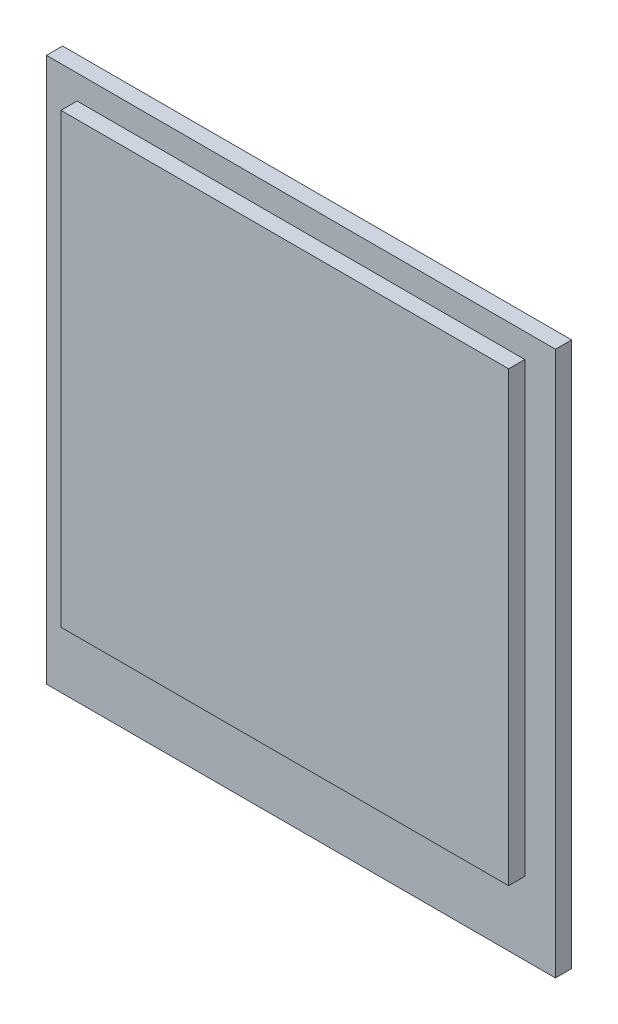
ISO-10303-21;
HEADER;
FILE_DESCRIPTION(('STEP AP214'),'2;1');
FILE_NAME('part.step','',(''),(''),'','','');
FILE_SCHEMA(('AUTOMOTIVE_DESIGN { 1 0 10303 214 1 1 1 1 }'));
ENDSEC;
DATA;
#1=APPLICATION_CONTEXT('core data for automotive mechanical design processes');
#2=APPLICATION_PROTOCOL_DEFINITION('international standard','automotive_design',2000,#1);
#3=PRODUCT_CONTEXT('',#1,'mechanical');
#4=PRODUCT('Part','Part','',(#3));
#5=PRODUCT_RELATED_PRODUCT_CATEGORY('part','',(#4));
#6=PRODUCT_DEFINITION_FORMATION('','',#4);
#7=PRODUCT_DEFINITION_CONTEXT('part definition',#1,'design');
#8=PRODUCT_DEFINITION('design','',#6,#7);
#9=PRODUCT_DEFINITION_SHAPE('','',#8);
#10=(LENGTH_UNIT() NAMED_UNIT(*) SI_UNIT(.MILLI.,.METRE.));
#11=(NAMED_UNIT(*) PLANE_ANGLE_UNIT() SI_UNIT($,.RADIAN.));
#12=(NAMED_UNIT(*) SI_UNIT($,.STERADIAN.) SOLID_ANGLE_UNIT());
#13=UNCERTAINTY_MEASURE_WITH_UNIT(LENGTH_MEASURE(1.E-05),#10,'distance_accuracy_value','');
#14=(GEOMETRIC_REPRESENTATION_CONTEXT(3) GLOBAL_UNCERTAINTY_ASSIGNED_CONTEXT((#13)) GLOBAL_UNIT_ASSIGNED_CONTEXT((#10,
#11,#12)) REPRESENTATION_CONTEXT('',''));
#15=CARTESIAN_POINT('',(0.,0.,0.));
#16=DIRECTION('',(0.,0.,1.));
#17=DIRECTION('',(1.,0.,0.));
#18=AXIS2_PLACEMENT_3D('',#15,#16,#17);
#19=CARTESIAN_POINT('',(13.86,-13.86,-1.));
#20=DIRECTION('',(1.,0.,0.));
#21=DIRECTION('',(0.,1.,0.));
#22=AXIS2_PLACEMENT_3D('',#19,#20,#21);
#23=PLANE('',#22);
#24=DIRECTION('',(0.,1.,0.));
#25=VECTOR('',#24,1.);
#26=CARTESIAN_POINT('',(13.86,-13.86,0.));
#27=LINE('',#26,#25);
#28=CARTESIAN_POINT('',(13.86,-13.86,0.));
#29=VERTEX_POINT('',#28);
#30=CARTESIAN_POINT('',(13.86,13.86,0.));
#31=VERTEX_POINT('',#30);
#32=EDGE_CURVE('E118',#29,#31,#27,.T.);
#33=ORIENTED_EDGE('',*,*,#32,.T.);
#34=DIRECTION('',(0.,0.,1.));
#35=VECTOR('',#34,1.);
#36=CARTESIAN_POINT('',(13.86,13.86,-1.));
#37=LINE('',#36,#35);
#38=CARTESIAN_POINT('',(13.86,13.86,1.));
#39=VERTEX_POINT('',#38);
#40=EDGE_CURVE('E42',#31,#39,#37,.T.);
#41=ORIENTED_EDGE('',*,*,#40,.T.);
#42=DIRECTION('',(0.,1.,0.));
#43=VECTOR('',#42,1.);
#44=CARTESIAN_POINT('',(13.86,-13.86,1.));
#45=LINE('',#44,#43);
#46=CARTESIAN_POINT('',(13.86,-13.86,1.));
#47=VERTEX_POINT('',#46);
#48=EDGE_CURVE('E167',#47,#39,#45,.T.);
#49=ORIENTED_EDGE('',*,*,#48,.F.);
#50=DIRECTION('',(0.,0.,1.));
#51=VECTOR('',#50,1.);
#52=CARTESIAN_POINT('',(13.86,-13.86,-1.));
#53=LINE('',#52,#51);
#54=EDGE_CURVE('E11',#29,#47,#53,.T.);
#55=ORIENTED_EDGE('',*,*,#54,.F.);
#56=EDGE_LOOP('',(#33,#41,#49,#55));
#57=FACE_BOUND('',#56,.T.);
#58=ADVANCED_FACE('F39',(#57),#23,.T.);
#59=CARTESIAN_POINT('',(-13.86,-13.86,-1.));
#60=DIRECTION('',(0.,-1.,0.));
#61=DIRECTION('',(1.,0.,0.));
#62=AXIS2_PLACEMENT_3D('',#59,#60,#61);
#63=PLANE('',#62);
#64=DIRECTION('',(1.,0.,0.));
#65=VECTOR('',#64,1.);
#66=CARTESIAN_POINT('',(-13.86,-13.86,0.));
#67=LINE('',#66,#65);
#68=CARTESIAN_POINT('',(-13.86,-13.86,0.));
#69=VERTEX_POINT('',#68);
#70=EDGE_CURVE('E55',#69,#29,#67,.T.);
#71=ORIENTED_EDGE('',*,*,#70,.T.);
#72=ORIENTED_EDGE('',*,*,#54,.T.);
#73=DIRECTION('',(1.,0.,0.));
#74=VECTOR('',#73,1.);
#75=CARTESIAN_POINT('',(-13.86,-13.86,1.));
#76=LINE('',#75,#74);
#77=CARTESIAN_POINT('',(-13.86,-13.86,1.));
#78=VERTEX_POINT('',#77);
#79=EDGE_CURVE('E116',#78,#47,#76,.T.);
#80=ORIENTED_EDGE('',*,*,#79,.F.);
#81=DIRECTION('',(0.,0.,1.));
#82=VECTOR('',#81,1.);
#83=CARTESIAN_POINT('',(-13.86,-13.86,-1.));
#84=LINE('',#83,#82);
#85=EDGE_CURVE('E48',#69,#78,#84,.T.);
#86=ORIENTED_EDGE('',*,*,#85,.F.);
#87=EDGE_LOOP('',(#71,#72,#80,#86));
#88=FACE_BOUND('',#87,.T.);
#89=ADVANCED_FACE('F194',(#88),#63,.T.);
#90=CARTESIAN_POINT('',(-13.86,13.86,-1.));
#91=DIRECTION('',(-1.,0.,0.));
#92=DIRECTION('',(0.,-1.,0.));
#93=AXIS2_PLACEMENT_3D('',#90,#91,#92);
#94=PLANE('',#93);
#95=DIRECTION('',(0.,-1.,0.));
#96=VECTOR('',#95,1.);
#97=CARTESIAN_POINT('',(-13.86,13.86,0.));
#98=LINE('',#97,#96);
#99=CARTESIAN_POINT('',(-13.86,13.86,0.));
#100=VERTEX_POINT('',#99);
#101=EDGE_CURVE('E63',#100,#69,#98,.T.);
#102=ORIENTED_EDGE('',*,*,#101,.T.);
#103=ORIENTED_EDGE('',*,*,#85,.T.);
#104=DIRECTION('',(0.,-1.,0.));
#105=VECTOR('',#104,1.);
#106=CARTESIAN_POINT('',(-13.86,13.86,1.));
#107=LINE('',#106,#105);
#108=CARTESIAN_POINT('',(-13.86,13.86,1.));
#109=VERTEX_POINT('',#108);
#110=EDGE_CURVE('E180',#109,#78,#107,.T.);
#111=ORIENTED_EDGE('',*,*,#110,.F.);
#112=DIRECTION('',(0.,0.,1.));
#113=VECTOR('',#112,1.);
#114=CARTESIAN_POINT('',(-13.86,13.86,-1.));
#115=LINE('',#114,#113);
#116=EDGE_CURVE('E115',#100,#109,#115,.T.);
#117=ORIENTED_EDGE('',*,*,#116,.F.);
#118=EDGE_LOOP('',(#102,#103,#111,#117));
#119=FACE_BOUND('',#118,.T.);
#120=ADVANCED_FACE('F193',(#119),#94,.T.);
#121=CARTESIAN_POINT('',(13.86,13.86,-1.));
#122=DIRECTION('',(0.,1.,0.));
#123=DIRECTION('',(-1.,0.,0.));
#124=AXIS2_PLACEMENT_3D('',#121,#122,#123);
#125=PLANE('',#124);
#126=DIRECTION('',(-1.,0.,0.));
#127=VECTOR('',#126,1.);
#128=CARTESIAN_POINT('',(13.86,13.86,0.));
#129=LINE('',#128,#127);
#130=EDGE_CURVE('E108',#31,#100,#129,.T.);
#131=ORIENTED_EDGE('',*,*,#130,.T.);
#132=ORIENTED_EDGE('',*,*,#116,.T.);
#133=DIRECTION('',(-1.,0.,0.));
#134=VECTOR('',#133,1.);
#135=CARTESIAN_POINT('',(13.86,13.86,1.));
#136=LINE('',#135,#134);
#137=EDGE_CURVE('E110',#39,#109,#136,.T.);
#138=ORIENTED_EDGE('',*,*,#137,.F.);
#139=ORIENTED_EDGE('',*,*,#40,.F.);
#140=EDGE_LOOP('',(#131,#132,#138,#139));
#141=FACE_BOUND('',#140,.T.);
#142=ADVANCED_FACE('F106',(#141),#125,.T.);
#143=CARTESIAN_POINT('',(0.,0.,1.));
#144=DIRECTION('',(0.,0.,1.));
#145=DIRECTION('',(1.,0.,0.));
#146=AXIS2_PLACEMENT_3D('',#143,#144,#145);
#147=PLANE('',#146);
#148=ORIENTED_EDGE('',*,*,#48,.T.);
#149=ORIENTED_EDGE('',*,*,#137,.T.);
#150=ORIENTED_EDGE('',*,*,#110,.T.);
#151=ORIENTED_EDGE('',*,*,#79,.T.);
#152=EDGE_LOOP('',(#148,#149,#150,#151));
#153=FACE_BOUND('',#152,.T.);
#154=ADVANCED_FACE('F191',(#153),#147,.T.);
#155=CARTESIAN_POINT('',(15.76,15.36,-1.));
#156=DIRECTION('',(0.,1.,0.));
#157=DIRECTION('',(-1.,0.,0.));
#158=AXIS2_PLACEMENT_3D('',#155,#156,#157);
#159=PLANE('',#158);
#160=DIRECTION('',(-1.,0.,0.));
#161=VECTOR('',#160,1.);
#162=CARTESIAN_POINT('',(15.76,15.36,0.));
#163=LINE('',#162,#161);
#164=CARTESIAN_POINT('',(15.76,15.36,0.));
#165=VERTEX_POINT('',#164);
#166=CARTESIAN_POINT('',(-15.76,15.36,0.));
#167=VERTEX_POINT('',#166);
#168=EDGE_CURVE('E121',#165,#167,#163,.T.);
#169=ORIENTED_EDGE('',*,*,#168,.F.);
#170=DIRECTION('',(0.,0.,1.));
#171=VECTOR('',#170,1.);
#172=CARTESIAN_POINT('',(15.76,15.36,-1.));
#173=LINE('',#172,#171);
#174=CARTESIAN_POINT('',(15.76,15.36,-1.));
#175=VERTEX_POINT('',#174);
#176=EDGE_CURVE('E164',#175,#165,#173,.T.);
#177=ORIENTED_EDGE('',*,*,#176,.F.);
#178=DIRECTION('',(-1.,0.,0.));
#179=VECTOR('',#178,1.);
#180=CARTESIAN_POINT('',(15.76,15.36,-1.));
#181=LINE('',#180,#179);
#182=CARTESIAN_POINT('',(-15.76,15.36,-1.));
#183=VERTEX_POINT('',#182);
#184=EDGE_CURVE('E132',#175,#183,#181,.T.);
#185=ORIENTED_EDGE('',*,*,#184,.T.);
#186=DIRECTION('',(0.,0.,1.));
#187=VECTOR('',#186,1.);
#188=CARTESIAN_POINT('',(-15.76,15.36,-1.));
#189=LINE('',#188,#187);
#190=EDGE_CURVE('E149',#183,#167,#189,.T.);
#191=ORIENTED_EDGE('',*,*,#190,.T.);
#192=EDGE_LOOP('',(#169,#177,#185,#191));
#193=FACE_BOUND('',#192,.T.);
#194=ADVANCED_FACE('F209',(#193),#159,.T.);
#195=CARTESIAN_POINT('',(15.76,-18.36,-1.));
#196=DIRECTION('',(1.,0.,0.));
#197=DIRECTION('',(0.,1.,0.));
#198=AXIS2_PLACEMENT_3D('',#195,#196,#197);
#199=PLANE('',#198);
#200=DIRECTION('',(0.,1.,0.));
#201=VECTOR('',#200,1.);
#202=CARTESIAN_POINT('',(15.76,-18.36,0.));
#203=LINE('',#202,#201);
#204=CARTESIAN_POINT('',(15.76,-18.36,0.));
#205=VERTEX_POINT('',#204);
#206=EDGE_CURVE('E137',#205,#165,#203,.T.);
#207=ORIENTED_EDGE('',*,*,#206,.F.);
#208=DIRECTION('',(0.,0.,1.));
#209=VECTOR('',#208,1.);
#210=CARTESIAN_POINT('',(15.76,-18.36,-1.));
#211=LINE('',#210,#209);
#212=CARTESIAN_POINT('',(15.76,-18.36,-1.));
#213=VERTEX_POINT('',#212);
#214=EDGE_CURVE('E168',#213,#205,#211,.T.);
#215=ORIENTED_EDGE('',*,*,#214,.F.);
#216=DIRECTION('',(0.,1.,0.));
#217=VECTOR('',#216,1.);
#218=CARTESIAN_POINT('',(15.76,-18.36,-1.));
#219=LINE('',#218,#217);
#220=EDGE_CURVE('E145',#213,#175,#219,.T.);
#221=ORIENTED_EDGE('',*,*,#220,.T.);
#222=ORIENTED_EDGE('',*,*,#176,.T.);
#223=EDGE_LOOP('',(#207,#215,#221,#222));
#224=FACE_BOUND('',#223,.T.);
#225=ADVANCED_FACE('F213',(#224),#199,.T.);
#226=CARTESIAN_POINT('',(-15.76,-18.36,-1.));
#227=DIRECTION('',(0.,-1.,0.));
#228=DIRECTION('',(1.,0.,0.));
#229=AXIS2_PLACEMENT_3D('',#226,#227,#228);
#230=PLANE('',#229);
#231=DIRECTION('',(1.,0.,0.));
#232=VECTOR('',#231,1.);
#233=CARTESIAN_POINT('',(-15.76,-18.36,0.));
#234=LINE('',#233,#232);
#235=CARTESIAN_POINT('',(-15.76,-18.36,0.));
#236=VERTEX_POINT('',#235);
#237=EDGE_CURVE('E157',#236,#205,#234,.T.);
#238=ORIENTED_EDGE('',*,*,#237,.F.);
#239=DIRECTION('',(0.,0.,1.));
#240=VECTOR('',#239,1.);
#241=CARTESIAN_POINT('',(-15.76,-18.36,-1.));
#242=LINE('',#241,#240);
#243=CARTESIAN_POINT('',(-15.76,-18.36,-1.));
#244=VERTEX_POINT('',#243);
#245=EDGE_CURVE('E171',#244,#236,#242,.T.);
#246=ORIENTED_EDGE('',*,*,#245,.F.);
#247=DIRECTION('',(1.,0.,0.));
#248=VECTOR('',#247,1.);
#249=CARTESIAN_POINT('',(-15.76,-18.36,-1.));
#250=LINE('',#249,#248);
#251=EDGE_CURVE('E141',#244,#213,#250,.T.);
#252=ORIENTED_EDGE('',*,*,#251,.T.);
#253=ORIENTED_EDGE('',*,*,#214,.T.);
#254=EDGE_LOOP('',(#238,#246,#252,#253));
#255=FACE_BOUND('',#254,.T.);
#256=ADVANCED_FACE('F220',(#255),#230,.T.);
#257=CARTESIAN_POINT('',(-15.76,15.36,-1.));
#258=DIRECTION('',(-1.,0.,0.));
#259=DIRECTION('',(0.,-1.,0.));
#260=AXIS2_PLACEMENT_3D('',#257,#258,#259);
#261=PLANE('',#260);
#262=DIRECTION('',(0.,-1.,0.));
#263=VECTOR('',#262,1.);
#264=CARTESIAN_POINT('',(-15.76,15.36,0.));
#265=LINE('',#264,#263);
#266=EDGE_CURVE('E153',#167,#236,#265,.T.);
#267=ORIENTED_EDGE('',*,*,#266,.F.);
#268=ORIENTED_EDGE('',*,*,#190,.F.);
#269=DIRECTION('',(0.,-1.,0.));
#270=VECTOR('',#269,1.);
#271=CARTESIAN_POINT('',(-15.76,15.36,-1.));
#272=LINE('',#271,#270);
#273=EDGE_CURVE('E136',#183,#244,#272,.T.);
#274=ORIENTED_EDGE('',*,*,#273,.T.);
#275=ORIENTED_EDGE('',*,*,#245,.T.);
#276=EDGE_LOOP('',(#267,#268,#274,#275));
#277=FACE_BOUND('',#276,.T.);
#278=ADVANCED_FACE('F217',(#277),#261,.T.);
#279=CARTESIAN_POINT('',(0.,0.,0.));
#280=DIRECTION('',(0.,0.,1.));
#281=DIRECTION('',(1.,0.,0.));
#282=AXIS2_PLACEMENT_3D('',#279,#280,#281);
#283=PLANE('',#282);
#284=ORIENTED_EDGE('',*,*,#130,.F.);
#285=ORIENTED_EDGE('',*,*,#32,.F.);
#286=ORIENTED_EDGE('',*,*,#70,.F.);
#287=ORIENTED_EDGE('',*,*,#101,.F.);
#288=EDGE_LOOP('',(#284,#285,#286,#287));
#289=FACE_BOUND('',#288,.T.);
#290=ORIENTED_EDGE('',*,*,#168,.T.);
#291=ORIENTED_EDGE('',*,*,#266,.T.);
#292=ORIENTED_EDGE('',*,*,#237,.T.);
#293=ORIENTED_EDGE('',*,*,#206,.T.);
#294=EDGE_LOOP('',(#290,#291,#292,#293));
#295=FACE_BOUND('',#294,.T.);
#296=ADVANCED_FACE('F123',(#289,#295),#283,.T.);
#297=CARTESIAN_POINT('',(0.,0.,-1.));
#298=DIRECTION('',(0.,0.,1.));
#299=DIRECTION('',(1.,0.,0.));
#300=AXIS2_PLACEMENT_3D('',#297,#298,#299);
#301=PLANE('',#300);
#302=ORIENTED_EDGE('',*,*,#184,.F.);
#303=ORIENTED_EDGE('',*,*,#220,.F.);
#304=ORIENTED_EDGE('',*,*,#251,.F.);
#305=ORIENTED_EDGE('',*,*,#273,.F.);
#306=EDGE_LOOP('',(#302,#303,#304,#305));
#307=FACE_BOUND('',#306,.T.);
#308=ADVANCED_FACE('F203',(#307),#301,.F.);
#309=CLOSED_SHELL('',(#58,#89,#120,#142,#154,#194,#225,#256,#278,#296,#308));
#310=MANIFOLD_SOLID_BREP('B2',#309);
#311=ADVANCED_BREP_SHAPE_REPRESENTATION('',(#18,#310),#14);
#312=SHAPE_DEFINITION_REPRESENTATION(#9,#311);
ENDSEC;
END-ISO-10303-21;
